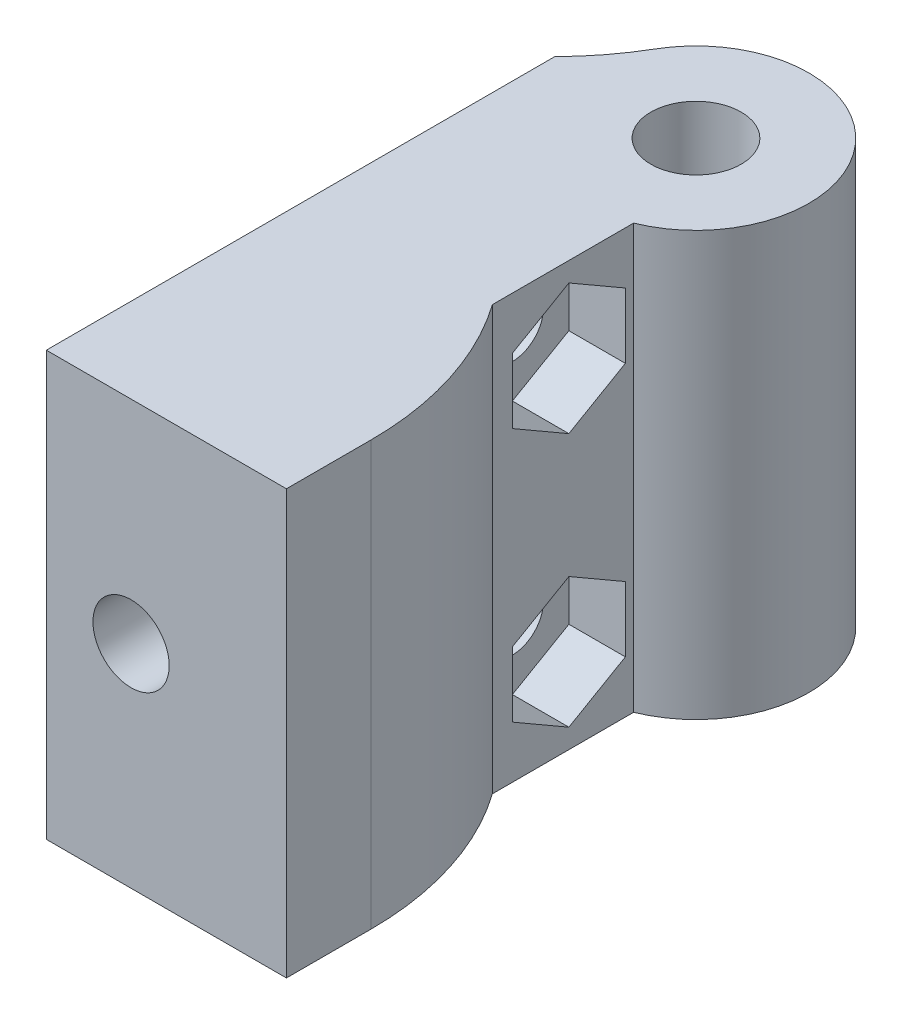
ISO-10303-21;
HEADER;
FILE_DESCRIPTION(('STEP AP214'),'2;1');
FILE_NAME('part.step','',(''),(''),'','','');
FILE_SCHEMA(('AUTOMOTIVE_DESIGN { 1 0 10303 214 1 1 1 1 }'));
ENDSEC;
DATA;
#1=APPLICATION_CONTEXT('core data for automotive mechanical design processes');
#2=APPLICATION_PROTOCOL_DEFINITION('international standard','automotive_design',2000,#1);
#3=PRODUCT_CONTEXT('',#1,'mechanical');
#4=PRODUCT('Part','Part','',(#3));
#5=PRODUCT_RELATED_PRODUCT_CATEGORY('part','',(#4));
#6=PRODUCT_DEFINITION_FORMATION('','',#4);
#7=PRODUCT_DEFINITION_CONTEXT('part definition',#1,'design');
#8=PRODUCT_DEFINITION('design','',#6,#7);
#9=PRODUCT_DEFINITION_SHAPE('','',#8);
#10=(LENGTH_UNIT() NAMED_UNIT(*) SI_UNIT(.MILLI.,.METRE.));
#11=(NAMED_UNIT(*) PLANE_ANGLE_UNIT() SI_UNIT($,.RADIAN.));
#12=(NAMED_UNIT(*) SI_UNIT($,.STERADIAN.) SOLID_ANGLE_UNIT());
#13=UNCERTAINTY_MEASURE_WITH_UNIT(LENGTH_MEASURE(1.E-05),#10,'distance_accuracy_value','');
#14=(GEOMETRIC_REPRESENTATION_CONTEXT(3) GLOBAL_UNCERTAINTY_ASSIGNED_CONTEXT((#13)) GLOBAL_UNIT_ASSIGNED_CONTEXT((#10,
#11,#12)) REPRESENTATION_CONTEXT('',''));
#15=CARTESIAN_POINT('',(0.,0.,0.));
#16=DIRECTION('',(0.,0.,1.));
#17=DIRECTION('',(1.,0.,0.));
#18=AXIS2_PLACEMENT_3D('',#15,#16,#17);
#19=CARTESIAN_POINT('',(1.5,7.5,3.70809924354783));
#20=DIRECTION('',(-1.,0.,0.));
#21=DIRECTION('',(0.,0.,1.));
#22=AXIS2_PLACEMENT_3D('',#19,#20,#21);
#23=PLANE('',#22);
#24=DIRECTION('',(0.,0.5,-0.866025403784439));
#25=VECTOR('',#24,1.);
#26=CARTESIAN_POINT('',(1.5,-2.2396286685487,-1.91507799004576));
#27=LINE('',#26,#25);
#28=CARTESIAN_POINT('',(1.5,-6.8094010767585,6.));
#29=VERTEX_POINT('',#28);
#30=CARTESIAN_POINT('',(1.5,-5.65470053837925,4.));
#31=VERTEX_POINT('',#30);
#32=EDGE_CURVE('E375',#29,#31,#27,.T.);
#33=ORIENTED_EDGE('',*,*,#32,.F.);
#34=DIRECTION('',(0.,-0.5,-0.866025403784439));
#35=VECTOR('',#34,1.);
#36=CARTESIAN_POINT('',(1.5,-4.22447294658905,10.4772268553675));
#37=LINE('',#36,#35);
#38=CARTESIAN_POINT('',(1.5,-5.65470053837925,8.));
#39=VERTEX_POINT('',#38);
#40=EDGE_CURVE('E359',#39,#29,#37,.T.);
#41=ORIENTED_EDGE('',*,*,#40,.F.);
#42=DIRECTION('',(0.,-1.,0.));
#43=VECTOR('',#42,1.);
#44=CARTESIAN_POINT('',(1.5,7.5,8.00000000000001));
#45=LINE('',#44,#43);
#46=CARTESIAN_POINT('',(1.5,-3.34529946162075,8.));
#47=VERTEX_POINT('',#46);
#48=EDGE_CURVE('E367',#47,#39,#45,.T.);
#49=ORIENTED_EDGE('',*,*,#48,.F.);
#50=DIRECTION('',(0.,-0.5,0.866025403784439));
#51=VECTOR('',#50,1.);
#52=CARTESIAN_POINT('',(1.5,1.22447294658905,0.0849220099542417));
#53=LINE('',#52,#51);
#54=CARTESIAN_POINT('',(1.5,-2.1905989232415,6.));
#55=VERTEX_POINT('',#54);
#56=EDGE_CURVE('E369',#55,#47,#53,.T.);
#57=ORIENTED_EDGE('',*,*,#56,.F.);
#58=DIRECTION('',(0.,0.5,0.866025403784439));
#59=VECTOR('',#58,1.);
#60=CARTESIAN_POINT('',(1.5,-0.760371331451298,8.4772268553675));
#61=LINE('',#60,#59);
#62=CARTESIAN_POINT('',(1.5,-3.34529946162075,4.));
#63=VERTEX_POINT('',#62);
#64=EDGE_CURVE('E371',#63,#55,#61,.T.);
#65=ORIENTED_EDGE('',*,*,#64,.F.);
#66=DIRECTION('',(0.,1.,0.));
#67=VECTOR('',#66,1.);
#68=CARTESIAN_POINT('',(1.5,7.5,4.00000000000001));
#69=LINE('',#68,#67);
#70=EDGE_CURVE('E373',#31,#63,#69,.T.);
#71=ORIENTED_EDGE('',*,*,#70,.F.);
#72=EDGE_LOOP('',(#33,#41,#49,#57,#65,#71));
#73=FACE_BOUND('',#72,.T.);
#74=DIRECTION('',(0.,0.,-1.));
#75=VECTOR('',#74,1.);
#76=CARTESIAN_POINT('',(1.5,-7.5,3.70809924354783));
#77=LINE('',#76,#75);
#78=CARTESIAN_POINT('',(1.5,-7.5,8.70809924354783));
#79=VERTEX_POINT('',#78);
#80=CARTESIAN_POINT('',(1.5,-7.5,3.70809924354783));
#81=VERTEX_POINT('',#80);
#82=EDGE_CURVE('E314',#79,#81,#77,.T.);
#83=ORIENTED_EDGE('',*,*,#82,.T.);
#84=DIRECTION('',(0.,-1.,0.));
#85=VECTOR('',#84,1.);
#86=CARTESIAN_POINT('',(1.5,7.5,3.70809924354783));
#87=LINE('',#86,#85);
#88=CARTESIAN_POINT('',(1.5,7.5,3.70809924354783));
#89=VERTEX_POINT('',#88);
#90=EDGE_CURVE('E324',#89,#81,#87,.T.);
#91=ORIENTED_EDGE('',*,*,#90,.F.);
#92=DIRECTION('',(0.,0.,-1.));
#93=VECTOR('',#92,1.);
#94=CARTESIAN_POINT('',(1.5,7.5,3.70809924354783));
#95=LINE('',#94,#93);
#96=CARTESIAN_POINT('',(1.5,7.5,8.70809924354783));
#97=VERTEX_POINT('',#96);
#98=EDGE_CURVE('E322',#97,#89,#95,.T.);
#99=ORIENTED_EDGE('',*,*,#98,.F.);
#100=DIRECTION('',(0.,-1.,0.));
#101=VECTOR('',#100,1.);
#102=CARTESIAN_POINT('',(1.5,7.5,8.70809924354783));
#103=LINE('',#102,#101);
#104=EDGE_CURVE('E338',#97,#79,#103,.T.);
#105=ORIENTED_EDGE('',*,*,#104,.T.);
#106=EDGE_LOOP('',(#83,#91,#99,#105));
#107=FACE_BOUND('',#106,.T.);
#108=DIRECTION('',(0.,-0.5,0.866025403784439));
#109=VECTOR('',#108,1.);
#110=CARTESIAN_POINT('',(1.5,7.97447294658905,3.98203632698422));
#111=LINE('',#110,#109);
#112=CARTESIAN_POINT('',(1.5,6.8094010767585,6.));
#113=VERTEX_POINT('',#112);
#114=CARTESIAN_POINT('',(1.5,5.65470053837925,8.));
#115=VERTEX_POINT('',#114);
#116=EDGE_CURVE('E11',#113,#115,#111,.T.);
#117=ORIENTED_EDGE('',*,*,#116,.F.);
#118=DIRECTION('',(0.,0.5,0.866025403784439));
#119=VECTOR('',#118,1.);
#120=CARTESIAN_POINT('',(1.5,5.9896286685487,4.58011253833753));
#121=LINE('',#120,#119);
#122=CARTESIAN_POINT('',(1.5,5.65470053837925,4.));
#123=VERTEX_POINT('',#122);
#124=EDGE_CURVE('E377',#123,#113,#121,.T.);
#125=ORIENTED_EDGE('',*,*,#124,.F.);
#126=DIRECTION('',(0.,1.,0.));
#127=VECTOR('',#126,1.);
#128=CARTESIAN_POINT('',(1.5,7.5,4.));
#129=LINE('',#128,#127);
#130=CARTESIAN_POINT('',(1.5,3.34529946162075,4.));
#131=VERTEX_POINT('',#130);
#132=EDGE_CURVE('E379',#131,#123,#129,.T.);
#133=ORIENTED_EDGE('',*,*,#132,.F.);
#134=DIRECTION('',(0.,0.5,-0.866025403784439));
#135=VECTOR('',#134,1.);
#136=CARTESIAN_POINT('',(1.5,4.5103713314513,1.98203632698421));
#137=LINE('',#136,#135);
#138=CARTESIAN_POINT('',(1.5,2.19059892324149,6.));
#139=VERTEX_POINT('',#138);
#140=EDGE_CURVE('E381',#139,#131,#137,.T.);
#141=ORIENTED_EDGE('',*,*,#140,.F.);
#142=DIRECTION('',(0.,-0.5,-0.866025403784439));
#143=VECTOR('',#142,1.);
#144=CARTESIAN_POINT('',(1.5,2.52552705341095,6.58011253833753));
#145=LINE('',#144,#143);
#146=CARTESIAN_POINT('',(1.5,3.34529946162075,8.));
#147=VERTEX_POINT('',#146);
#148=EDGE_CURVE('E383',#147,#139,#145,.T.);
#149=ORIENTED_EDGE('',*,*,#148,.F.);
#150=DIRECTION('',(0.,-1.,0.));
#151=VECTOR('',#150,1.);
#152=CARTESIAN_POINT('',(1.5,7.5,8.));
#153=LINE('',#152,#151);
#154=EDGE_CURVE('E42',#115,#147,#153,.T.);
#155=ORIENTED_EDGE('',*,*,#154,.F.);
#156=EDGE_LOOP('',(#117,#125,#133,#141,#149,#155));
#157=FACE_BOUND('',#156,.T.);
#158=ADVANCED_FACE('F34',(#73,#107,#157),#23,.F.);
#159=CARTESIAN_POINT('',(-5.,4.5,6.));
#160=DIRECTION('',(1.,0.,0.));
#161=DIRECTION('',(0.,0.,-1.));
#162=AXIS2_PLACEMENT_3D('',#159,#160,#161);
#163=CYLINDRICAL_SURFACE('',#162,1.1);
#164=CARTESIAN_POINT('',(-5.,4.5,6.));
#165=DIRECTION('',(1.,0.,0.));
#166=DIRECTION('',(0.,0.,-1.));
#167=AXIS2_PLACEMENT_3D('',#164,#165,#166);
#168=CIRCLE('',#167,1.1);
#169=CARTESIAN_POINT('',(-5.,4.5,4.9));
#170=VERTEX_POINT('',#169);
#171=EDGE_CURVE('E298',#170,#170,#168,.T.);
#172=ORIENTED_EDGE('',*,*,#171,.F.);
#173=EDGE_LOOP('',(#172));
#174=FACE_BOUND('',#173,.T.);
#175=CARTESIAN_POINT('',(-0.499999999999997,4.5,6.));
#176=DIRECTION('',(1.,0.,0.));
#177=DIRECTION('',(0.,0.,-1.));
#178=AXIS2_PLACEMENT_3D('',#175,#176,#177);
#179=CIRCLE('',#178,1.1);
#180=CARTESIAN_POINT('',(-0.499999999999997,4.5,4.9));
#181=VERTEX_POINT('',#180);
#182=EDGE_CURVE('E198',#181,#181,#179,.F.);
#183=ORIENTED_EDGE('',*,*,#182,.F.);
#184=EDGE_LOOP('',(#183));
#185=FACE_BOUND('',#184,.T.);
#186=ADVANCED_FACE('F410',(#174,#185),#163,.F.);
#187=CARTESIAN_POINT('',(0.,7.5,0.));
#188=DIRECTION('',(0.,1.,0.));
#189=DIRECTION('',(0.,0.,1.));
#190=AXIS2_PLACEMENT_3D('',#187,#188,#189);
#191=PLANE('',#190);
#192=CARTESIAN_POINT('',(0.,7.5,0.));
#193=DIRECTION('',(0.,1.,0.));
#194=DIRECTION('',(0.,0.,1.));
#195=AXIS2_PLACEMENT_3D('',#192,#193,#194);
#196=CIRCLE('',#195,4.);
#197=CARTESIAN_POINT('',(-3.45714285714286,7.5,-2.01200478759523));
#198=VERTEX_POINT('',#197);
#199=EDGE_CURVE('E310',#89,#198,#196,.T.);
#200=ORIENTED_EDGE('',*,*,#199,.T.);
#201=CARTESIAN_POINT('',(-12.1,7.5,-7.0420167565833));
#202=DIRECTION('',(0.,1.,0.));
#203=DIRECTION('',(0.,0.,1.));
#204=AXIS2_PLACEMENT_3D('',#201,#202,#203);
#205=CIRCLE('',#204,10.);
#206=CARTESIAN_POINT('',(-5.,7.5,0.));
#207=VERTEX_POINT('',#206);
#208=EDGE_CURVE('E357',#198,#207,#205,.F.);
#209=ORIENTED_EDGE('',*,*,#208,.T.);
#210=DIRECTION('',(0.,0.,1.));
#211=VECTOR('',#210,1.);
#212=CARTESIAN_POINT('',(-5.,7.5,18.));
#213=LINE('',#212,#211);
#214=CARTESIAN_POINT('',(-5.,7.5,18.));
#215=VERTEX_POINT('',#214);
#216=EDGE_CURVE('E313',#207,#215,#213,.T.);
#217=ORIENTED_EDGE('',*,*,#216,.T.);
#218=DIRECTION('',(1.,0.,0.));
#219=VECTOR('',#218,1.);
#220=CARTESIAN_POINT('',(-5.,7.5,18.));
#221=LINE('',#220,#219);
#222=CARTESIAN_POINT('',(3.5,7.5,18.));
#223=VERTEX_POINT('',#222);
#224=EDGE_CURVE('E316',#215,#223,#221,.T.);
#225=ORIENTED_EDGE('',*,*,#224,.T.);
#226=DIRECTION('',(0.,0.,-1.));
#227=VECTOR('',#226,1.);
#228=CARTESIAN_POINT('',(3.5,7.5,18.));
#229=LINE('',#228,#227);
#230=CARTESIAN_POINT('',(3.5,7.5,15.));
#231=VERTEX_POINT('',#230);
#232=EDGE_CURVE('E318',#223,#231,#229,.T.);
#233=ORIENTED_EDGE('',*,*,#232,.T.);
#234=CARTESIAN_POINT('',(-7.39700378226084,7.5,15.));
#235=DIRECTION('',(0.,1.,0.));
#236=DIRECTION('',(0.,0.,1.));
#237=AXIS2_PLACEMENT_3D('',#234,#235,#236);
#238=CIRCLE('',#237,10.8970037822608);
#239=EDGE_CURVE('E320',#231,#97,#238,.T.);
#240=ORIENTED_EDGE('',*,*,#239,.T.);
#241=ORIENTED_EDGE('',*,*,#98,.T.);
#242=EDGE_LOOP('',(#200,#209,#217,#225,#233,#240,#241));
#243=FACE_BOUND('',#242,.T.);
#244=CARTESIAN_POINT('',(0.,7.5,0.));
#245=DIRECTION('',(0.,1.,0.));
#246=DIRECTION('',(0.,0.,1.));
#247=AXIS2_PLACEMENT_3D('',#244,#245,#246);
#248=CIRCLE('',#247,1.6);
#249=CARTESIAN_POINT('',(0.,7.5,1.6));
#250=VERTEX_POINT('',#249);
#251=EDGE_CURVE('E304',#250,#250,#248,.T.);
#252=ORIENTED_EDGE('',*,*,#251,.F.);
#253=EDGE_LOOP('',(#252));
#254=FACE_BOUND('',#253,.T.);
#255=ADVANCED_FACE('F416',(#243,#254),#191,.T.);
#256=CARTESIAN_POINT('',(0.,-7.5,0.));
#257=DIRECTION('',(0.,1.,0.));
#258=DIRECTION('',(0.,0.,1.));
#259=AXIS2_PLACEMENT_3D('',#256,#257,#258);
#260=PLANE('',#259);
#261=CARTESIAN_POINT('',(0.,-7.5,0.));
#262=DIRECTION('',(0.,1.,0.));
#263=DIRECTION('',(0.,0.,1.));
#264=AXIS2_PLACEMENT_3D('',#261,#262,#263);
#265=CIRCLE('',#264,4.);
#266=CARTESIAN_POINT('',(-3.45714285714286,-7.5,-2.01200478759523));
#267=VERTEX_POINT('',#266);
#268=EDGE_CURVE('E307',#81,#267,#265,.T.);
#269=ORIENTED_EDGE('',*,*,#268,.F.);
#270=ORIENTED_EDGE('',*,*,#82,.F.);
#271=CARTESIAN_POINT('',(-7.39700378226084,-7.5,15.));
#272=DIRECTION('',(0.,1.,0.));
#273=DIRECTION('',(0.,0.,1.));
#274=AXIS2_PLACEMENT_3D('',#271,#272,#273);
#275=CIRCLE('',#274,10.8970037822608);
#276=CARTESIAN_POINT('',(3.5,-7.5,15.));
#277=VERTEX_POINT('',#276);
#278=EDGE_CURVE('E333',#277,#79,#275,.T.);
#279=ORIENTED_EDGE('',*,*,#278,.F.);
#280=DIRECTION('',(0.,0.,-1.));
#281=VECTOR('',#280,1.);
#282=CARTESIAN_POINT('',(3.5,-7.5,18.));
#283=LINE('',#282,#281);
#284=CARTESIAN_POINT('',(3.5,-7.5,18.));
#285=VERTEX_POINT('',#284);
#286=EDGE_CURVE('E331',#285,#277,#283,.T.);
#287=ORIENTED_EDGE('',*,*,#286,.F.);
#288=DIRECTION('',(1.,0.,0.));
#289=VECTOR('',#288,1.);
#290=CARTESIAN_POINT('',(-5.,-7.5,18.));
#291=LINE('',#290,#289);
#292=CARTESIAN_POINT('',(-5.,-7.5,18.));
#293=VERTEX_POINT('',#292);
#294=EDGE_CURVE('E329',#293,#285,#291,.T.);
#295=ORIENTED_EDGE('',*,*,#294,.F.);
#296=DIRECTION('',(0.,0.,1.));
#297=VECTOR('',#296,1.);
#298=CARTESIAN_POINT('',(-5.,-7.5,18.));
#299=LINE('',#298,#297);
#300=CARTESIAN_POINT('',(-5.,-7.5,0.));
#301=VERTEX_POINT('',#300);
#302=EDGE_CURVE('E327',#301,#293,#299,.T.);
#303=ORIENTED_EDGE('',*,*,#302,.F.);
#304=CARTESIAN_POINT('',(-12.1,-7.5,-7.0420167565833));
#305=DIRECTION('',(0.,1.,0.));
#306=DIRECTION('',(0.,0.,1.));
#307=AXIS2_PLACEMENT_3D('',#304,#305,#306);
#308=CIRCLE('',#307,10.);
#309=EDGE_CURVE('E355',#301,#267,#308,.T.);
#310=ORIENTED_EDGE('',*,*,#309,.T.);
#311=EDGE_LOOP('',(#269,#270,#279,#287,#295,#303,#310));
#312=FACE_BOUND('',#311,.T.);
#313=CARTESIAN_POINT('',(0.,-7.5,0.));
#314=DIRECTION('',(0.,1.,0.));
#315=DIRECTION('',(0.,0.,1.));
#316=AXIS2_PLACEMENT_3D('',#313,#314,#315);
#317=CIRCLE('',#316,1.6);
#318=CARTESIAN_POINT('',(0.,-7.5,1.6));
#319=VERTEX_POINT('',#318);
#320=EDGE_CURVE('E301',#319,#319,#317,.T.);
#321=ORIENTED_EDGE('',*,*,#320,.T.);
#322=EDGE_LOOP('',(#321));
#323=FACE_BOUND('',#322,.T.);
#324=ADVANCED_FACE('F423',(#312,#323),#260,.F.);
#325=CARTESIAN_POINT('',(0.,7.5,0.));
#326=DIRECTION('',(0.,-1.,0.));
#327=DIRECTION('',(0.,0.,-1.));
#328=AXIS2_PLACEMENT_3D('',#325,#326,#327);
#329=CYLINDRICAL_SURFACE('',#328,4.);
#330=ORIENTED_EDGE('',*,*,#268,.T.);
#331=DIRECTION('',(0.,-1.,0.));
#332=VECTOR('',#331,1.);
#333=CARTESIAN_POINT('',(-3.45714285714286,7.5,-2.01200478759523));
#334=LINE('',#333,#332);
#335=EDGE_CURVE('E353',#267,#198,#334,.F.);
#336=ORIENTED_EDGE('',*,*,#335,.T.);
#337=ORIENTED_EDGE('',*,*,#199,.F.);
#338=ORIENTED_EDGE('',*,*,#90,.T.);
#339=EDGE_LOOP('',(#330,#336,#337,#338));
#340=FACE_BOUND('',#339,.T.);
#341=ADVANCED_FACE('F440',(#340),#329,.T.);
#342=CARTESIAN_POINT('',(-5.,7.5,18.));
#343=DIRECTION('',(1.,0.,0.));
#344=DIRECTION('',(0.,0.,-1.));
#345=AXIS2_PLACEMENT_3D('',#342,#343,#344);
#346=PLANE('',#345);
#347=DIRECTION('',(0.,0.,1.));
#348=VECTOR('',#347,1.);
#349=CARTESIAN_POINT('',(-5.,-2.5,15.));
#350=LINE('',#349,#348);
#351=CARTESIAN_POINT('',(-5.,-2.5,11.));
#352=VERTEX_POINT('',#351);
#353=CARTESIAN_POINT('',(-5.,-2.5,15.));
#354=VERTEX_POINT('',#353);
#355=EDGE_CURVE('E276',#352,#354,#350,.T.);
#356=ORIENTED_EDGE('',*,*,#355,.F.);
#357=DIRECTION('',(0.,-1.,0.));
#358=VECTOR('',#357,1.);
#359=CARTESIAN_POINT('',(-5.,-2.5,11.));
#360=LINE('',#359,#358);
#361=CARTESIAN_POINT('',(-5.,2.5,11.));
#362=VERTEX_POINT('',#361);
#363=EDGE_CURVE('E274',#362,#352,#360,.T.);
#364=ORIENTED_EDGE('',*,*,#363,.F.);
#365=DIRECTION('',(0.,0.,-1.));
#366=VECTOR('',#365,1.);
#367=CARTESIAN_POINT('',(-5.,2.5,15.));
#368=LINE('',#367,#366);
#369=CARTESIAN_POINT('',(-5.,2.5,15.));
#370=VERTEX_POINT('',#369);
#371=EDGE_CURVE('E264',#370,#362,#368,.T.);
#372=ORIENTED_EDGE('',*,*,#371,.F.);
#373=DIRECTION('',(0.,1.,0.));
#374=VECTOR('',#373,1.);
#375=CARTESIAN_POINT('',(-5.,-2.5,15.));
#376=LINE('',#375,#374);
#377=EDGE_CURVE('E280',#354,#370,#376,.T.);
#378=ORIENTED_EDGE('',*,*,#377,.F.);
#379=EDGE_LOOP('',(#356,#364,#372,#378));
#380=FACE_BOUND('',#379,.T.);
#381=ORIENTED_EDGE('',*,*,#171,.T.);
#382=EDGE_LOOP('',(#381));
#383=FACE_BOUND('',#382,.T.);
#384=CARTESIAN_POINT('',(-5.,-4.5,6.));
#385=DIRECTION('',(1.,0.,0.));
#386=DIRECTION('',(0.,0.,1.));
#387=AXIS2_PLACEMENT_3D('',#384,#385,#386);
#388=CIRCLE('',#387,1.1);
#389=CARTESIAN_POINT('',(-5.,-4.5,7.1));
#390=VERTEX_POINT('',#389);
#391=EDGE_CURVE('E297',#390,#390,#388,.T.);
#392=ORIENTED_EDGE('',*,*,#391,.T.);
#393=EDGE_LOOP('',(#392));
#394=FACE_BOUND('',#393,.T.);
#395=ORIENTED_EDGE('',*,*,#302,.T.);
#396=DIRECTION('',(0.,-1.,0.));
#397=VECTOR('',#396,1.);
#398=CARTESIAN_POINT('',(-5.,7.5,18.));
#399=LINE('',#398,#397);
#400=EDGE_CURVE('E347',#215,#293,#399,.T.);
#401=ORIENTED_EDGE('',*,*,#400,.F.);
#402=ORIENTED_EDGE('',*,*,#216,.F.);
#403=DIRECTION('',(0.,-1.,0.));
#404=VECTOR('',#403,1.);
#405=CARTESIAN_POINT('',(-5.,7.5,0.));
#406=LINE('',#405,#404);
#407=EDGE_CURVE('E350',#207,#301,#406,.T.);
#408=ORIENTED_EDGE('',*,*,#407,.T.);
#409=EDGE_LOOP('',(#395,#401,#402,#408));
#410=FACE_BOUND('',#409,.T.);
#411=ADVANCED_FACE('F437',(#380,#383,#394,#410),#346,.F.);
#412=CARTESIAN_POINT('',(-5.,7.5,18.));
#413=DIRECTION('',(0.,0.,-1.));
#414=DIRECTION('',(-1.,0.,0.));
#415=AXIS2_PLACEMENT_3D('',#412,#413,#414);
#416=PLANE('',#415);
#417=CARTESIAN_POINT('',(-2.,0.,18.));
#418=DIRECTION('',(0.,0.,1.));
#419=DIRECTION('',(1.,0.,0.));
#420=AXIS2_PLACEMENT_3D('',#417,#418,#419);
#421=CIRCLE('',#420,1.35);
#422=CARTESIAN_POINT('',(-0.649999999999997,0.,18.));
#423=VERTEX_POINT('',#422);
#424=EDGE_CURVE('E294',#423,#423,#421,.T.);
#425=ORIENTED_EDGE('',*,*,#424,.F.);
#426=EDGE_LOOP('',(#425));
#427=FACE_BOUND('',#426,.T.);
#428=ORIENTED_EDGE('',*,*,#294,.T.);
#429=DIRECTION('',(0.,-1.,0.));
#430=VECTOR('',#429,1.);
#431=CARTESIAN_POINT('',(3.5,7.5,18.));
#432=LINE('',#431,#430);
#433=EDGE_CURVE('E344',#223,#285,#432,.T.);
#434=ORIENTED_EDGE('',*,*,#433,.F.);
#435=ORIENTED_EDGE('',*,*,#224,.F.);
#436=ORIENTED_EDGE('',*,*,#400,.T.);
#437=EDGE_LOOP('',(#428,#434,#435,#436));
#438=FACE_BOUND('',#437,.T.);
#439=ADVANCED_FACE('F433',(#427,#438),#416,.F.);
#440=CARTESIAN_POINT('',(3.5,7.5,18.));
#441=DIRECTION('',(-1.,0.,0.));
#442=DIRECTION('',(0.,0.,1.));
#443=AXIS2_PLACEMENT_3D('',#440,#441,#442);
#444=PLANE('',#443);
#445=ORIENTED_EDGE('',*,*,#286,.T.);
#446=DIRECTION('',(0.,-1.,0.));
#447=VECTOR('',#446,1.);
#448=CARTESIAN_POINT('',(3.5,7.5,15.));
#449=LINE('',#448,#447);
#450=EDGE_CURVE('E341',#231,#277,#449,.T.);
#451=ORIENTED_EDGE('',*,*,#450,.F.);
#452=ORIENTED_EDGE('',*,*,#232,.F.);
#453=ORIENTED_EDGE('',*,*,#433,.T.);
#454=EDGE_LOOP('',(#445,#451,#452,#453));
#455=FACE_BOUND('',#454,.T.);
#456=ADVANCED_FACE('F429',(#455),#444,.F.);
#457=CARTESIAN_POINT('',(-7.39700378226084,7.5,15.));
#458=DIRECTION('',(0.,-1.,0.));
#459=DIRECTION('',(0.,0.,-1.));
#460=AXIS2_PLACEMENT_3D('',#457,#458,#459);
#461=CYLINDRICAL_SURFACE('',#460,10.8970037822608);
#462=ORIENTED_EDGE('',*,*,#278,.T.);
#463=ORIENTED_EDGE('',*,*,#104,.F.);
#464=ORIENTED_EDGE('',*,*,#239,.F.);
#465=ORIENTED_EDGE('',*,*,#450,.T.);
#466=EDGE_LOOP('',(#462,#463,#464,#465));
#467=FACE_BOUND('',#466,.T.);
#468=ADVANCED_FACE('F425',(#467),#461,.T.);
#469=CARTESIAN_POINT('',(0.,7.5,0.));
#470=DIRECTION('',(0.,-1.,0.));
#471=DIRECTION('',(0.,0.,-1.));
#472=AXIS2_PLACEMENT_3D('',#469,#470,#471);
#473=CYLINDRICAL_SURFACE('',#472,1.6);
#474=ORIENTED_EDGE('',*,*,#251,.T.);
#475=EDGE_LOOP('',(#474));
#476=FACE_BOUND('',#475,.T.);
#477=ORIENTED_EDGE('',*,*,#320,.F.);
#478=EDGE_LOOP('',(#477));
#479=FACE_BOUND('',#478,.T.);
#480=ADVANCED_FACE('F428',(#476,#479),#473,.F.);
#481=CARTESIAN_POINT('',(-5.,-4.5,6.));
#482=DIRECTION('',(1.,0.,0.));
#483=DIRECTION('',(0.,0.,-1.));
#484=AXIS2_PLACEMENT_3D('',#481,#482,#483);
#485=CYLINDRICAL_SURFACE('',#484,1.1);
#486=CARTESIAN_POINT('',(-0.499999999999998,-4.5,6.));
#487=DIRECTION('',(-1.,0.,0.));
#488=DIRECTION('',(0.,0.,1.));
#489=AXIS2_PLACEMENT_3D('',#486,#487,#488);
#490=CIRCLE('',#489,1.1);
#491=CARTESIAN_POINT('',(-0.499999999999998,-4.5,7.1));
#492=VERTEX_POINT('',#491);
#493=EDGE_CURVE('E277',#492,#492,#490,.F.);
#494=ORIENTED_EDGE('',*,*,#493,.T.);
#495=EDGE_LOOP('',(#494));
#496=FACE_BOUND('',#495,.T.);
#497=ORIENTED_EDGE('',*,*,#391,.F.);
#498=EDGE_LOOP('',(#497));
#499=FACE_BOUND('',#498,.T.);
#500=ADVANCED_FACE('F477',(#496,#499),#485,.F.);
#501=CARTESIAN_POINT('',(-12.1,7.5,-7.0420167565833));
#502=DIRECTION('',(0.,1.,0.));
#503=DIRECTION('',(0.,0.,1.));
#504=AXIS2_PLACEMENT_3D('',#501,#502,#503);
#505=CYLINDRICAL_SURFACE('',#504,10.);
#506=ORIENTED_EDGE('',*,*,#208,.F.);
#507=ORIENTED_EDGE('',*,*,#335,.F.);
#508=ORIENTED_EDGE('',*,*,#309,.F.);
#509=ORIENTED_EDGE('',*,*,#407,.F.);
#510=EDGE_LOOP('',(#506,#507,#508,#509));
#511=FACE_BOUND('',#510,.T.);
#512=ADVANCED_FACE('F36',(#511),#505,.F.);
#513=CARTESIAN_POINT('',(-2.,0.,14.));
#514=DIRECTION('',(0.,0.,1.));
#515=DIRECTION('',(1.,0.,0.));
#516=AXIS2_PLACEMENT_3D('',#513,#514,#515);
#517=CYLINDRICAL_SURFACE('',#516,1.35);
#518=CARTESIAN_POINT('',(-2.,0.,15.));
#519=DIRECTION('',(0.,0.,1.));
#520=DIRECTION('',(1.,0.,0.));
#521=AXIS2_PLACEMENT_3D('',#518,#519,#520);
#522=CIRCLE('',#521,1.35);
#523=CARTESIAN_POINT('',(-0.649999999999997,0.,15.));
#524=VERTEX_POINT('',#523);
#525=EDGE_CURVE('E287',#524,#524,#522,.F.);
#526=ORIENTED_EDGE('',*,*,#525,.T.);
#527=EDGE_LOOP('',(#526));
#528=FACE_BOUND('',#527,.T.);
#529=ORIENTED_EDGE('',*,*,#424,.T.);
#530=EDGE_LOOP('',(#529));
#531=FACE_BOUND('',#530,.T.);
#532=ADVANCED_FACE('F508',(#528,#531),#517,.F.);
#533=CARTESIAN_POINT('',(1.,-2.5,15.));
#534=DIRECTION('',(0.,0.,1.));
#535=DIRECTION('',(1.,0.,0.));
#536=AXIS2_PLACEMENT_3D('',#533,#534,#535);
#537=PLANE('',#536);
#538=ORIENTED_EDGE('',*,*,#377,.T.);
#539=DIRECTION('',(-1.,0.,0.));
#540=VECTOR('',#539,1.);
#541=CARTESIAN_POINT('',(1.,2.5,15.));
#542=LINE('',#541,#540);
#543=CARTESIAN_POINT('',(1.,2.5,15.));
#544=VERTEX_POINT('',#543);
#545=EDGE_CURVE('E288',#544,#370,#542,.T.);
#546=ORIENTED_EDGE('',*,*,#545,.F.);
#547=DIRECTION('',(0.,1.,0.));
#548=VECTOR('',#547,1.);
#549=CARTESIAN_POINT('',(1.,-2.5,15.));
#550=LINE('',#549,#548);
#551=CARTESIAN_POINT('',(1.,-2.5,15.));
#552=VERTEX_POINT('',#551);
#553=EDGE_CURVE('E267',#552,#544,#550,.T.);
#554=ORIENTED_EDGE('',*,*,#553,.F.);
#555=DIRECTION('',(-1.,0.,0.));
#556=VECTOR('',#555,1.);
#557=CARTESIAN_POINT('',(1.,-2.5,15.));
#558=LINE('',#557,#556);
#559=EDGE_CURVE('E290',#552,#354,#558,.T.);
#560=ORIENTED_EDGE('',*,*,#559,.T.);
#561=EDGE_LOOP('',(#538,#546,#554,#560));
#562=FACE_BOUND('',#561,.T.);
#563=ORIENTED_EDGE('',*,*,#525,.F.);
#564=EDGE_LOOP('',(#563));
#565=FACE_BOUND('',#564,.T.);
#566=ADVANCED_FACE('F529',(#562,#565),#537,.F.);
#567=CARTESIAN_POINT('',(1.,-2.5,11.));
#568=DIRECTION('',(0.,0.,-1.));
#569=DIRECTION('',(-1.,0.,0.));
#570=AXIS2_PLACEMENT_3D('',#567,#568,#569);
#571=PLANE('',#570);
#572=ORIENTED_EDGE('',*,*,#363,.T.);
#573=DIRECTION('',(-1.,0.,0.));
#574=VECTOR('',#573,1.);
#575=CARTESIAN_POINT('',(1.,-2.5,11.));
#576=LINE('',#575,#574);
#577=CARTESIAN_POINT('',(1.,-2.5,11.));
#578=VERTEX_POINT('',#577);
#579=EDGE_CURVE('E273',#578,#352,#576,.T.);
#580=ORIENTED_EDGE('',*,*,#579,.F.);
#581=DIRECTION('',(0.,-1.,0.));
#582=VECTOR('',#581,1.);
#583=CARTESIAN_POINT('',(1.,-2.5,11.));
#584=LINE('',#583,#582);
#585=CARTESIAN_POINT('',(1.,2.5,11.));
#586=VERTEX_POINT('',#585);
#587=EDGE_CURVE('E260',#586,#578,#584,.T.);
#588=ORIENTED_EDGE('',*,*,#587,.F.);
#589=DIRECTION('',(-1.,0.,0.));
#590=VECTOR('',#589,1.);
#591=CARTESIAN_POINT('',(1.,2.5,11.));
#592=LINE('',#591,#590);
#593=EDGE_CURVE('E285',#586,#362,#592,.T.);
#594=ORIENTED_EDGE('',*,*,#593,.T.);
#595=EDGE_LOOP('',(#572,#580,#588,#594));
#596=FACE_BOUND('',#595,.T.);
#597=ADVANCED_FACE('F539',(#596),#571,.F.);
#598=CARTESIAN_POINT('',(1.,2.5,15.));
#599=DIRECTION('',(0.,1.,0.));
#600=DIRECTION('',(0.,0.,1.));
#601=AXIS2_PLACEMENT_3D('',#598,#599,#600);
#602=PLANE('',#601);
#603=ORIENTED_EDGE('',*,*,#371,.T.);
#604=ORIENTED_EDGE('',*,*,#593,.F.);
#605=DIRECTION('',(0.,0.,-1.));
#606=VECTOR('',#605,1.);
#607=CARTESIAN_POINT('',(1.,2.5,15.));
#608=LINE('',#607,#606);
#609=EDGE_CURVE('E270',#544,#586,#608,.T.);
#610=ORIENTED_EDGE('',*,*,#609,.F.);
#611=ORIENTED_EDGE('',*,*,#545,.T.);
#612=EDGE_LOOP('',(#603,#604,#610,#611));
#613=FACE_BOUND('',#612,.T.);
#614=ADVANCED_FACE('F549',(#613),#602,.F.);
#615=CARTESIAN_POINT('',(1.,-2.5,15.));
#616=DIRECTION('',(0.,-1.,0.));
#617=DIRECTION('',(0.,0.,-1.));
#618=AXIS2_PLACEMENT_3D('',#615,#616,#617);
#619=PLANE('',#618);
#620=ORIENTED_EDGE('',*,*,#355,.T.);
#621=ORIENTED_EDGE('',*,*,#559,.F.);
#622=DIRECTION('',(0.,0.,1.));
#623=VECTOR('',#622,1.);
#624=CARTESIAN_POINT('',(1.,-2.5,15.));
#625=LINE('',#624,#623);
#626=EDGE_CURVE('E263',#578,#552,#625,.T.);
#627=ORIENTED_EDGE('',*,*,#626,.F.);
#628=ORIENTED_EDGE('',*,*,#579,.T.);
#629=EDGE_LOOP('',(#620,#621,#627,#628));
#630=FACE_BOUND('',#629,.T.);
#631=ADVANCED_FACE('F559',(#630),#619,.F.);
#632=CARTESIAN_POINT('',(1.,0.,0.));
#633=DIRECTION('',(-1.,0.,0.));
#634=DIRECTION('',(0.,0.,1.));
#635=AXIS2_PLACEMENT_3D('',#632,#633,#634);
#636=PLANE('',#635);
#637=ORIENTED_EDGE('',*,*,#587,.T.);
#638=ORIENTED_EDGE('',*,*,#626,.T.);
#639=ORIENTED_EDGE('',*,*,#553,.T.);
#640=ORIENTED_EDGE('',*,*,#609,.T.);
#641=EDGE_LOOP('',(#637,#638,#639,#640));
#642=FACE_BOUND('',#641,.T.);
#643=ADVANCED_FACE('F569',(#642),#636,.T.);
#644=CARTESIAN_POINT('',(4.,6.8094010767585,6.));
#645=DIRECTION('',(0.,-0.866025403784438,-0.5));
#646=DIRECTION('',(0.,0.5,-0.866025403784439));
#647=AXIS2_PLACEMENT_3D('',#644,#645,#646);
#648=PLANE('',#647);
#649=ORIENTED_EDGE('',*,*,#116,.T.);
#650=DIRECTION('',(-1.,0.,0.));
#651=VECTOR('',#650,1.);
#652=CARTESIAN_POINT('',(4.,5.65470053837925,8.));
#653=LINE('',#652,#651);
#654=CARTESIAN_POINT('',(-0.499999999999997,5.65470053837925,8.));
#655=VERTEX_POINT('',#654);
#656=EDGE_CURVE('E188',#115,#655,#653,.T.);
#657=ORIENTED_EDGE('',*,*,#656,.T.);
#658=DIRECTION('',(0.,-0.5,0.866025403784438));
#659=VECTOR('',#658,1.);
#660=CARTESIAN_POINT('',(-0.499999999999997,6.8094010767585,6.));
#661=LINE('',#660,#659);
#662=CARTESIAN_POINT('',(-0.499999999999997,6.8094010767585,6.));
#663=VERTEX_POINT('',#662);
#664=EDGE_CURVE('E193',#663,#655,#661,.T.);
#665=ORIENTED_EDGE('',*,*,#664,.F.);
#666=DIRECTION('',(-1.,0.,0.));
#667=VECTOR('',#666,1.);
#668=CARTESIAN_POINT('',(4.,6.8094010767585,6.));
#669=LINE('',#668,#667);
#670=EDGE_CURVE('E226',#113,#663,#669,.T.);
#671=ORIENTED_EDGE('',*,*,#670,.F.);
#672=EDGE_LOOP('',(#649,#657,#665,#671));
#673=FACE_BOUND('',#672,.T.);
#674=ADVANCED_FACE('F190',(#673),#648,.T.);
#675=CARTESIAN_POINT('',(4.,5.65470053837925,8.));
#676=DIRECTION('',(0.,0.,-1.));
#677=DIRECTION('',(-1.,0.,0.));
#678=AXIS2_PLACEMENT_3D('',#675,#676,#677);
#679=PLANE('',#678);
#680=ORIENTED_EDGE('',*,*,#154,.T.);
#681=DIRECTION('',(-1.,0.,0.));
#682=VECTOR('',#681,1.);
#683=CARTESIAN_POINT('',(4.,3.34529946162075,8.));
#684=LINE('',#683,#682);
#685=CARTESIAN_POINT('',(-0.499999999999997,3.34529946162075,8.));
#686=VERTEX_POINT('',#685);
#687=EDGE_CURVE('E199',#147,#686,#684,.T.);
#688=ORIENTED_EDGE('',*,*,#687,.T.);
#689=DIRECTION('',(0.,-1.,0.));
#690=VECTOR('',#689,1.);
#691=CARTESIAN_POINT('',(-0.499999999999997,5.65470053837925,8.));
#692=LINE('',#691,#690);
#693=EDGE_CURVE('E202',#655,#686,#692,.T.);
#694=ORIENTED_EDGE('',*,*,#693,.F.);
#695=ORIENTED_EDGE('',*,*,#656,.F.);
#696=EDGE_LOOP('',(#680,#688,#694,#695));
#697=FACE_BOUND('',#696,.T.);
#698=ADVANCED_FACE('F203',(#697),#679,.T.);
#699=CARTESIAN_POINT('',(4.,3.34529946162075,8.));
#700=DIRECTION('',(0.,0.866025403784439,-0.5));
#701=DIRECTION('',(0.,0.5,0.866025403784439));
#702=AXIS2_PLACEMENT_3D('',#699,#700,#701);
#703=PLANE('',#702);
#704=ORIENTED_EDGE('',*,*,#148,.T.);
#705=DIRECTION('',(-1.,0.,0.));
#706=VECTOR('',#705,1.);
#707=CARTESIAN_POINT('',(4.,2.19059892324149,6.));
#708=LINE('',#707,#706);
#709=CARTESIAN_POINT('',(-0.499999999999997,2.19059892324149,6.));
#710=VERTEX_POINT('',#709);
#711=EDGE_CURVE('E231',#139,#710,#708,.T.);
#712=ORIENTED_EDGE('',*,*,#711,.T.);
#713=DIRECTION('',(0.,-0.5,-0.866025403784439));
#714=VECTOR('',#713,1.);
#715=CARTESIAN_POINT('',(-0.499999999999997,3.34529946162075,8.));
#716=LINE('',#715,#714);
#717=EDGE_CURVE('E208',#686,#710,#716,.T.);
#718=ORIENTED_EDGE('',*,*,#717,.F.);
#719=ORIENTED_EDGE('',*,*,#687,.F.);
#720=EDGE_LOOP('',(#704,#712,#718,#719));
#721=FACE_BOUND('',#720,.T.);
#722=ADVANCED_FACE('F387',(#721),#703,.T.);
#723=CARTESIAN_POINT('',(4.,2.19059892324149,6.));
#724=DIRECTION('',(0.,0.866025403784439,0.5));
#725=DIRECTION('',(0.,-0.5,0.866025403784439));
#726=AXIS2_PLACEMENT_3D('',#723,#724,#725);
#727=PLANE('',#726);
#728=ORIENTED_EDGE('',*,*,#140,.T.);
#729=DIRECTION('',(-1.,0.,0.));
#730=VECTOR('',#729,1.);
#731=CARTESIAN_POINT('',(4.,3.34529946162075,4.));
#732=LINE('',#731,#730);
#733=CARTESIAN_POINT('',(-0.499999999999998,3.34529946162075,4.));
#734=VERTEX_POINT('',#733);
#735=EDGE_CURVE('E229',#131,#734,#732,.T.);
#736=ORIENTED_EDGE('',*,*,#735,.T.);
#737=DIRECTION('',(0.,0.5,-0.866025403784438));
#738=VECTOR('',#737,1.);
#739=CARTESIAN_POINT('',(-0.499999999999997,2.19059892324149,6.));
#740=LINE('',#739,#738);
#741=EDGE_CURVE('E220',#710,#734,#740,.T.);
#742=ORIENTED_EDGE('',*,*,#741,.F.);
#743=ORIENTED_EDGE('',*,*,#711,.F.);
#744=EDGE_LOOP('',(#728,#736,#742,#743));
#745=FACE_BOUND('',#744,.T.);
#746=ADVANCED_FACE('F394',(#745),#727,.T.);
#747=CARTESIAN_POINT('',(4.,3.34529946162075,4.));
#748=DIRECTION('',(0.,0.,1.));
#749=DIRECTION('',(0.,-1.,0.));
#750=AXIS2_PLACEMENT_3D('',#747,#748,#749);
#751=PLANE('',#750);
#752=ORIENTED_EDGE('',*,*,#132,.T.);
#753=DIRECTION('',(-1.,0.,0.));
#754=VECTOR('',#753,1.);
#755=CARTESIAN_POINT('',(4.,5.65470053837925,4.));
#756=LINE('',#755,#754);
#757=CARTESIAN_POINT('',(-0.499999999999998,5.65470053837925,4.));
#758=VERTEX_POINT('',#757);
#759=EDGE_CURVE('E49',#123,#758,#756,.T.);
#760=ORIENTED_EDGE('',*,*,#759,.T.);
#761=DIRECTION('',(0.,1.,0.));
#762=VECTOR('',#761,1.);
#763=CARTESIAN_POINT('',(-0.499999999999998,3.34529946162075,4.));
#764=LINE('',#763,#762);
#765=EDGE_CURVE('E223',#734,#758,#764,.T.);
#766=ORIENTED_EDGE('',*,*,#765,.F.);
#767=ORIENTED_EDGE('',*,*,#735,.F.);
#768=EDGE_LOOP('',(#752,#760,#766,#767));
#769=FACE_BOUND('',#768,.T.);
#770=ADVANCED_FACE('F398',(#769),#751,.T.);
#771=CARTESIAN_POINT('',(4.,5.65470053837925,4.));
#772=DIRECTION('',(0.,-0.866025403784439,0.5));
#773=DIRECTION('',(0.,-0.5,-0.866025403784439));
#774=AXIS2_PLACEMENT_3D('',#771,#772,#773);
#775=PLANE('',#774);
#776=ORIENTED_EDGE('',*,*,#124,.T.);
#777=ORIENTED_EDGE('',*,*,#670,.T.);
#778=DIRECTION('',(0.,0.5,0.866025403784439));
#779=VECTOR('',#778,1.);
#780=CARTESIAN_POINT('',(-0.499999999999998,5.65470053837925,4.));
#781=LINE('',#780,#779);
#782=EDGE_CURVE('E213',#758,#663,#781,.T.);
#783=ORIENTED_EDGE('',*,*,#782,.F.);
#784=ORIENTED_EDGE('',*,*,#759,.F.);
#785=EDGE_LOOP('',(#776,#777,#783,#784));
#786=FACE_BOUND('',#785,.T.);
#787=ADVANCED_FACE('F399',(#786),#775,.T.);
#788=CARTESIAN_POINT('',(-0.499999999999998,0.,0.));
#789=DIRECTION('',(1.,0.,0.));
#790=DIRECTION('',(0.,0.,-1.));
#791=AXIS2_PLACEMENT_3D('',#788,#789,#790);
#792=PLANE('',#791);
#793=ORIENTED_EDGE('',*,*,#664,.T.);
#794=ORIENTED_EDGE('',*,*,#693,.T.);
#795=ORIENTED_EDGE('',*,*,#717,.T.);
#796=ORIENTED_EDGE('',*,*,#741,.T.);
#797=ORIENTED_EDGE('',*,*,#765,.T.);
#798=ORIENTED_EDGE('',*,*,#782,.T.);
#799=EDGE_LOOP('',(#793,#794,#795,#796,#797,#798));
#800=FACE_BOUND('',#799,.T.);
#801=ORIENTED_EDGE('',*,*,#182,.T.);
#802=EDGE_LOOP('',(#801));
#803=FACE_BOUND('',#802,.T.);
#804=ADVANCED_FACE('F210',(#800,#803),#792,.T.);
#805=CARTESIAN_POINT('',(4.,-5.65470053837925,4.));
#806=DIRECTION('',(0.,0.866025403784439,0.5));
#807=DIRECTION('',(0.,-0.5,0.866025403784439));
#808=AXIS2_PLACEMENT_3D('',#805,#806,#807);
#809=PLANE('',#808);
#810=ORIENTED_EDGE('',*,*,#32,.T.);
#811=DIRECTION('',(-1.,0.,0.));
#812=VECTOR('',#811,1.);
#813=CARTESIAN_POINT('',(4.,-5.65470053837925,4.));
#814=LINE('',#813,#812);
#815=CARTESIAN_POINT('',(-0.499999999999998,-5.65470053837925,4.));
#816=VERTEX_POINT('',#815);
#817=EDGE_CURVE('E214',#31,#816,#814,.T.);
#818=ORIENTED_EDGE('',*,*,#817,.T.);
#819=DIRECTION('',(0.,0.5,-0.866025403784439));
#820=VECTOR('',#819,1.);
#821=CARTESIAN_POINT('',(-0.499999999999998,-5.65470053837925,4.));
#822=LINE('',#821,#820);
#823=CARTESIAN_POINT('',(-0.499999999999997,-6.8094010767585,6.));
#824=VERTEX_POINT('',#823);
#825=EDGE_CURVE('E234',#824,#816,#822,.T.);
#826=ORIENTED_EDGE('',*,*,#825,.F.);
#827=DIRECTION('',(-1.,0.,0.));
#828=VECTOR('',#827,1.);
#829=CARTESIAN_POINT('',(4.,-6.8094010767585,6.));
#830=LINE('',#829,#828);
#831=EDGE_CURVE('E252',#29,#824,#830,.T.);
#832=ORIENTED_EDGE('',*,*,#831,.F.);
#833=EDGE_LOOP('',(#810,#818,#826,#832));
#834=FACE_BOUND('',#833,.T.);
#835=ADVANCED_FACE('F406',(#834),#809,.T.);
#836=CARTESIAN_POINT('',(4.,-3.34529946162075,4.));
#837=DIRECTION('',(0.,0.,1.));
#838=DIRECTION('',(0.,-1.,0.));
#839=AXIS2_PLACEMENT_3D('',#836,#837,#838);
#840=PLANE('',#839);
#841=ORIENTED_EDGE('',*,*,#70,.T.);
#842=DIRECTION('',(-1.,0.,0.));
#843=VECTOR('',#842,1.);
#844=CARTESIAN_POINT('',(4.,-3.34529946162075,4.));
#845=LINE('',#844,#843);
#846=CARTESIAN_POINT('',(-0.499999999999998,-3.34529946162075,4.));
#847=VERTEX_POINT('',#846);
#848=EDGE_CURVE('E216',#63,#847,#845,.T.);
#849=ORIENTED_EDGE('',*,*,#848,.T.);
#850=DIRECTION('',(0.,1.,0.));
#851=VECTOR('',#850,1.);
#852=CARTESIAN_POINT('',(-0.499999999999998,-3.34529946162075,4.));
#853=LINE('',#852,#851);
#854=EDGE_CURVE('E237',#816,#847,#853,.T.);
#855=ORIENTED_EDGE('',*,*,#854,.F.);
#856=ORIENTED_EDGE('',*,*,#817,.F.);
#857=EDGE_LOOP('',(#841,#849,#855,#856));
#858=FACE_BOUND('',#857,.T.);
#859=ADVANCED_FACE('F650',(#858),#840,.T.);
#860=CARTESIAN_POINT('',(4.,-2.1905989232415,6.));
#861=DIRECTION('',(0.,-0.866025403784439,0.5));
#862=DIRECTION('',(0.,-0.5,-0.866025403784439));
#863=AXIS2_PLACEMENT_3D('',#860,#861,#862);
#864=PLANE('',#863);
#865=ORIENTED_EDGE('',*,*,#64,.T.);
#866=DIRECTION('',(-1.,0.,0.));
#867=VECTOR('',#866,1.);
#868=CARTESIAN_POINT('',(4.,-2.1905989232415,6.));
#869=LINE('',#868,#867);
#870=CARTESIAN_POINT('',(-0.499999999999997,-2.1905989232415,6.));
#871=VERTEX_POINT('',#870);
#872=EDGE_CURVE('E257',#55,#871,#869,.T.);
#873=ORIENTED_EDGE('',*,*,#872,.T.);
#874=DIRECTION('',(0.,0.5,0.866025403784439));
#875=VECTOR('',#874,1.);
#876=CARTESIAN_POINT('',(-0.499999999999997,-2.1905989232415,6.));
#877=LINE('',#876,#875);
#878=EDGE_CURVE('E240',#847,#871,#877,.T.);
#879=ORIENTED_EDGE('',*,*,#878,.F.);
#880=ORIENTED_EDGE('',*,*,#848,.F.);
#881=EDGE_LOOP('',(#865,#873,#879,#880));
#882=FACE_BOUND('',#881,.T.);
#883=ADVANCED_FACE('F660',(#882),#864,.T.);
#884=CARTESIAN_POINT('',(4.,-3.34529946162075,8.));
#885=DIRECTION('',(0.,-0.866025403784439,-0.5));
#886=DIRECTION('',(0.,0.5,-0.866025403784439));
#887=AXIS2_PLACEMENT_3D('',#884,#885,#886);
#888=PLANE('',#887);
#889=ORIENTED_EDGE('',*,*,#56,.T.);
#890=DIRECTION('',(-1.,0.,0.));
#891=VECTOR('',#890,1.);
#892=CARTESIAN_POINT('',(4.,-3.34529946162075,8.));
#893=LINE('',#892,#891);
#894=CARTESIAN_POINT('',(-0.499999999999997,-3.34529946162075,8.));
#895=VERTEX_POINT('',#894);
#896=EDGE_CURVE('E255',#47,#895,#893,.T.);
#897=ORIENTED_EDGE('',*,*,#896,.T.);
#898=DIRECTION('',(0.,-0.5,0.866025403784439));
#899=VECTOR('',#898,1.);
#900=CARTESIAN_POINT('',(-0.499999999999997,-3.34529946162075,8.));
#901=LINE('',#900,#899);
#902=EDGE_CURVE('E243',#871,#895,#901,.T.);
#903=ORIENTED_EDGE('',*,*,#902,.F.);
#904=ORIENTED_EDGE('',*,*,#872,.F.);
#905=EDGE_LOOP('',(#889,#897,#903,#904));
#906=FACE_BOUND('',#905,.T.);
#907=ADVANCED_FACE('F670',(#906),#888,.T.);
#908=CARTESIAN_POINT('',(4.,-5.65470053837925,8.));
#909=DIRECTION('',(0.,0.,-1.));
#910=DIRECTION('',(0.,1.,0.));
#911=AXIS2_PLACEMENT_3D('',#908,#909,#910);
#912=PLANE('',#911);
#913=ORIENTED_EDGE('',*,*,#48,.T.);
#914=DIRECTION('',(-1.,0.,0.));
#915=VECTOR('',#914,1.);
#916=CARTESIAN_POINT('',(4.,-5.65470053837925,8.));
#917=LINE('',#916,#915);
#918=CARTESIAN_POINT('',(-0.499999999999997,-5.65470053837925,8.));
#919=VERTEX_POINT('',#918);
#920=EDGE_CURVE('E57',#39,#919,#917,.T.);
#921=ORIENTED_EDGE('',*,*,#920,.T.);
#922=DIRECTION('',(0.,-1.,0.));
#923=VECTOR('',#922,1.);
#924=CARTESIAN_POINT('',(-0.499999999999997,-5.65470053837925,8.));
#925=LINE('',#924,#923);
#926=EDGE_CURVE('E246',#895,#919,#925,.T.);
#927=ORIENTED_EDGE('',*,*,#926,.F.);
#928=ORIENTED_EDGE('',*,*,#896,.F.);
#929=EDGE_LOOP('',(#913,#921,#927,#928));
#930=FACE_BOUND('',#929,.T.);
#931=ADVANCED_FACE('F680',(#930),#912,.T.);
#932=CARTESIAN_POINT('',(4.,-6.8094010767585,6.));
#933=DIRECTION('',(0.,0.866025403784438,-0.5));
#934=DIRECTION('',(0.,0.5,0.866025403784439));
#935=AXIS2_PLACEMENT_3D('',#932,#933,#934);
#936=PLANE('',#935);
#937=ORIENTED_EDGE('',*,*,#40,.T.);
#938=ORIENTED_EDGE('',*,*,#831,.T.);
#939=DIRECTION('',(0.,-0.5,-0.866025403784438));
#940=VECTOR('',#939,1.);
#941=CARTESIAN_POINT('',(-0.499999999999997,-6.8094010767585,6.));
#942=LINE('',#941,#940);
#943=EDGE_CURVE('E249',#919,#824,#942,.T.);
#944=ORIENTED_EDGE('',*,*,#943,.F.);
#945=ORIENTED_EDGE('',*,*,#920,.F.);
#946=EDGE_LOOP('',(#937,#938,#944,#945));
#947=FACE_BOUND('',#946,.T.);
#948=ADVANCED_FACE('F690',(#947),#936,.T.);
#949=CARTESIAN_POINT('',(-0.499999999999999,0.,0.));
#950=DIRECTION('',(-1.,0.,0.));
#951=DIRECTION('',(0.,0.,1.));
#952=AXIS2_PLACEMENT_3D('',#949,#950,#951);
#953=PLANE('',#952);
#954=ORIENTED_EDGE('',*,*,#825,.T.);
#955=ORIENTED_EDGE('',*,*,#854,.T.);
#956=ORIENTED_EDGE('',*,*,#878,.T.);
#957=ORIENTED_EDGE('',*,*,#902,.T.);
#958=ORIENTED_EDGE('',*,*,#926,.T.);
#959=ORIENTED_EDGE('',*,*,#943,.T.);
#960=EDGE_LOOP('',(#954,#955,#956,#957,#958,#959));
#961=FACE_BOUND('',#960,.T.);
#962=ORIENTED_EDGE('',*,*,#493,.F.);
#963=EDGE_LOOP('',(#962));
#964=FACE_BOUND('',#963,.T.);
#965=ADVANCED_FACE('F700',(#961,#964),#953,.F.);
#966=CLOSED_SHELL('',(#158,#186,#255,#324,#341,#411,#439,#456,#468,#480,#500,#512,#532,#566,
#597,#614,#631,#643,#674,#698,#722,#746,#770,#787,#804,#835,#859,#883,#907,#931,#948,#965));
#967=MANIFOLD_SOLID_BREP('B2',#966);
#968=ADVANCED_BREP_SHAPE_REPRESENTATION('',(#18,#967),#14);
#969=SHAPE_DEFINITION_REPRESENTATION(#9,#968);
ENDSEC;
END-ISO-10303-21;
